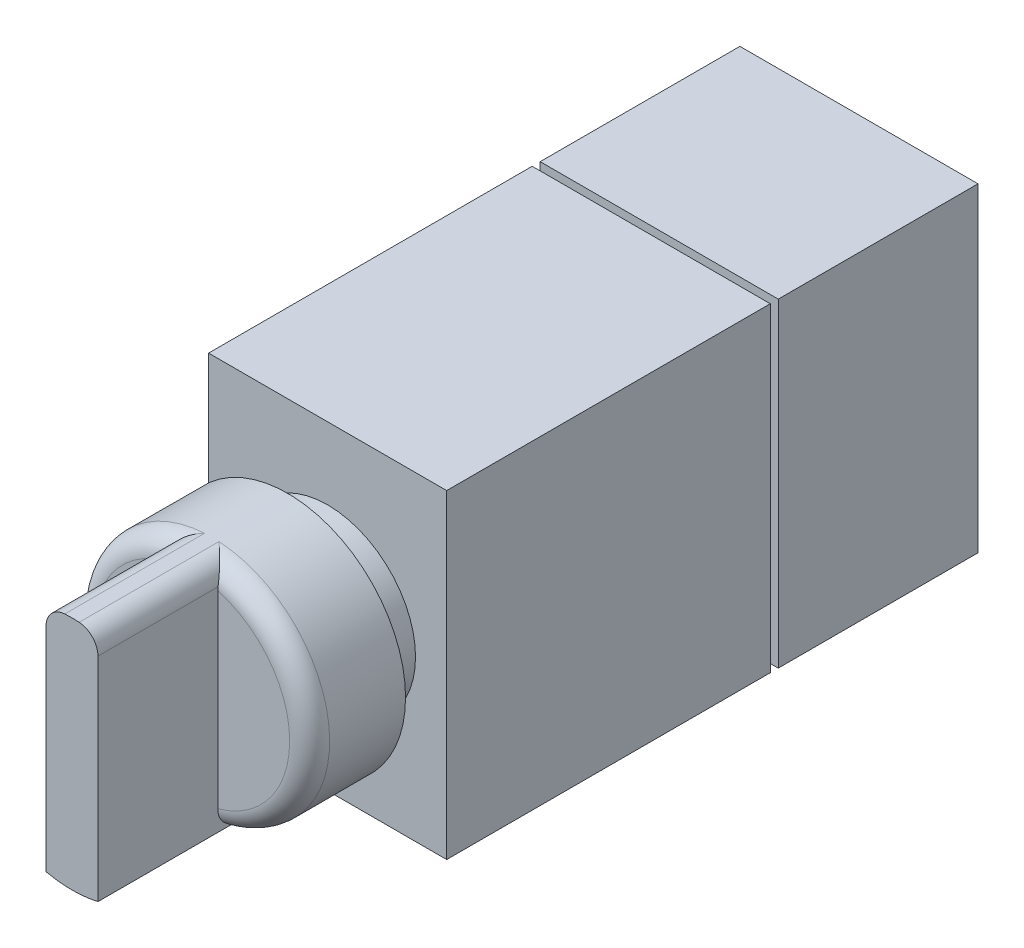
ISO-10303-21;
HEADER;
FILE_DESCRIPTION(('STEP AP214'),'2;1');
FILE_NAME('part.step','',(''),(''),'','','');
FILE_SCHEMA(('AUTOMOTIVE_DESIGN { 1 0 10303 214 1 1 1 1 }'));
ENDSEC;
DATA;
#1=APPLICATION_CONTEXT('core data for automotive mechanical design processes');
#2=APPLICATION_PROTOCOL_DEFINITION('international standard','automotive_design',2000,#1);
#3=PRODUCT_CONTEXT('',#1,'mechanical');
#4=PRODUCT('Part','Part','',(#3));
#5=PRODUCT_RELATED_PRODUCT_CATEGORY('part','',(#4));
#6=PRODUCT_DEFINITION_FORMATION('','',#4);
#7=PRODUCT_DEFINITION_CONTEXT('part definition',#1,'design');
#8=PRODUCT_DEFINITION('design','',#6,#7);
#9=PRODUCT_DEFINITION_SHAPE('','',#8);
#10=(LENGTH_UNIT() NAMED_UNIT(*) SI_UNIT(.MILLI.,.METRE.));
#11=(NAMED_UNIT(*) PLANE_ANGLE_UNIT() SI_UNIT($,.RADIAN.));
#12=(NAMED_UNIT(*) SI_UNIT($,.STERADIAN.) SOLID_ANGLE_UNIT());
#13=UNCERTAINTY_MEASURE_WITH_UNIT(LENGTH_MEASURE(1.E-05),#10,'distance_accuracy_value','');
#14=(GEOMETRIC_REPRESENTATION_CONTEXT(3) GLOBAL_UNCERTAINTY_ASSIGNED_CONTEXT((#13)) GLOBAL_UNIT_ASSIGNED_CONTEXT((#10,
#11,#12)) REPRESENTATION_CONTEXT('',''));
#15=CARTESIAN_POINT('',(0.,0.,0.));
#16=DIRECTION('',(0.,0.,1.));
#17=DIRECTION('',(1.,0.,0.));
#18=AXIS2_PLACEMENT_3D('',#15,#16,#17);
#19=CARTESIAN_POINT('',(-14.9,20.,-71.5));
#20=DIRECTION('',(0.,-1.,0.));
#21=DIRECTION('',(0.,0.,-1.));
#22=AXIS2_PLACEMENT_3D('',#19,#20,#21);
#23=PLANE('',#22);
#24=DIRECTION('',(1.,0.,0.));
#25=VECTOR('',#24,1.);
#26=CARTESIAN_POINT('',(-14.9,20.,-46.5));
#27=LINE('',#26,#25);
#28=CARTESIAN_POINT('',(-14.9,20.,-46.5));
#29=VERTEX_POINT('',#28);
#30=CARTESIAN_POINT('',(14.9,20.,-46.5));
#31=VERTEX_POINT('',#30);
#32=EDGE_CURVE('E108',#29,#31,#27,.T.);
#33=ORIENTED_EDGE('',*,*,#32,.T.);
#34=DIRECTION('',(0.,0.,1.));
#35=VECTOR('',#34,1.);
#36=CARTESIAN_POINT('',(14.9,20.,-71.5));
#37=LINE('',#36,#35);
#38=CARTESIAN_POINT('',(14.9,20.,-71.5));
#39=VERTEX_POINT('',#38);
#40=EDGE_CURVE('E12',#39,#31,#37,.T.);
#41=ORIENTED_EDGE('',*,*,#40,.F.);
#42=DIRECTION('',(1.,0.,0.));
#43=VECTOR('',#42,1.);
#44=CARTESIAN_POINT('',(-14.9,20.,-71.5));
#45=LINE('',#44,#43);
#46=CARTESIAN_POINT('',(-14.9,20.,-71.5));
#47=VERTEX_POINT('',#46);
#48=EDGE_CURVE('E96',#47,#39,#45,.T.);
#49=ORIENTED_EDGE('',*,*,#48,.F.);
#50=DIRECTION('',(0.,0.,1.));
#51=VECTOR('',#50,1.);
#52=CARTESIAN_POINT('',(-14.9,20.,-71.5));
#53=LINE('',#52,#51);
#54=EDGE_CURVE('E104',#47,#29,#53,.T.);
#55=ORIENTED_EDGE('',*,*,#54,.T.);
#56=EDGE_LOOP('',(#33,#41,#49,#55));
#57=FACE_BOUND('',#56,.T.);
#58=ADVANCED_FACE('F45',(#57),#23,.F.);
#59=CARTESIAN_POINT('',(14.9,20.,-71.5));
#60=DIRECTION('',(-1.,0.,0.));
#61=DIRECTION('',(0.,-1.,0.));
#62=AXIS2_PLACEMENT_3D('',#59,#60,#61);
#63=PLANE('',#62);
#64=DIRECTION('',(0.,-1.,0.));
#65=VECTOR('',#64,1.);
#66=CARTESIAN_POINT('',(14.9,20.,-46.5));
#67=LINE('',#66,#65);
#68=CARTESIAN_POINT('',(14.9,-20.,-46.5));
#69=VERTEX_POINT('',#68);
#70=EDGE_CURVE('E100',#31,#69,#67,.T.);
#71=ORIENTED_EDGE('',*,*,#70,.T.);
#72=DIRECTION('',(0.,0.,1.));
#73=VECTOR('',#72,1.);
#74=CARTESIAN_POINT('',(14.9,-20.,-71.5));
#75=LINE('',#74,#73);
#76=CARTESIAN_POINT('',(14.9,-20.,-71.5));
#77=VERTEX_POINT('',#76);
#78=EDGE_CURVE('E53',#77,#69,#75,.T.);
#79=ORIENTED_EDGE('',*,*,#78,.F.);
#80=DIRECTION('',(0.,-1.,0.));
#81=VECTOR('',#80,1.);
#82=CARTESIAN_POINT('',(14.9,20.,-71.5));
#83=LINE('',#82,#81);
#84=EDGE_CURVE('E91',#39,#77,#83,.T.);
#85=ORIENTED_EDGE('',*,*,#84,.F.);
#86=ORIENTED_EDGE('',*,*,#40,.T.);
#87=EDGE_LOOP('',(#71,#79,#85,#86));
#88=FACE_BOUND('',#87,.T.);
#89=ADVANCED_FACE('F99',(#88),#63,.F.);
#90=CARTESIAN_POINT('',(14.9,-20.,-71.5));
#91=DIRECTION('',(0.,1.,0.));
#92=DIRECTION('',(0.,0.,1.));
#93=AXIS2_PLACEMENT_3D('',#90,#91,#92);
#94=PLANE('',#93);
#95=DIRECTION('',(-1.,0.,0.));
#96=VECTOR('',#95,1.);
#97=CARTESIAN_POINT('',(14.9,-20.,-46.5));
#98=LINE('',#97,#96);
#99=CARTESIAN_POINT('',(-14.9,-20.,-46.5));
#100=VERTEX_POINT('',#99);
#101=EDGE_CURVE('E78',#69,#100,#98,.T.);
#102=ORIENTED_EDGE('',*,*,#101,.T.);
#103=DIRECTION('',(0.,0.,1.));
#104=VECTOR('',#103,1.);
#105=CARTESIAN_POINT('',(-14.9,-20.,-71.5));
#106=LINE('',#105,#104);
#107=CARTESIAN_POINT('',(-14.9,-20.,-71.5));
#108=VERTEX_POINT('',#107);
#109=EDGE_CURVE('E101',#108,#100,#106,.T.);
#110=ORIENTED_EDGE('',*,*,#109,.F.);
#111=DIRECTION('',(-1.,0.,0.));
#112=VECTOR('',#111,1.);
#113=CARTESIAN_POINT('',(14.9,-20.,-71.5));
#114=LINE('',#113,#112);
#115=EDGE_CURVE('E94',#77,#108,#114,.T.);
#116=ORIENTED_EDGE('',*,*,#115,.F.);
#117=ORIENTED_EDGE('',*,*,#78,.T.);
#118=EDGE_LOOP('',(#102,#110,#116,#117));
#119=FACE_BOUND('',#118,.T.);
#120=ADVANCED_FACE('F102',(#119),#94,.F.);
#121=CARTESIAN_POINT('',(-14.9,-20.,-71.5));
#122=DIRECTION('',(1.,0.,0.));
#123=DIRECTION('',(0.,1.,0.));
#124=AXIS2_PLACEMENT_3D('',#121,#122,#123);
#125=PLANE('',#124);
#126=DIRECTION('',(0.,1.,0.));
#127=VECTOR('',#126,1.);
#128=CARTESIAN_POINT('',(-14.9,-20.,-46.5));
#129=LINE('',#128,#127);
#130=EDGE_CURVE('E84',#100,#29,#129,.T.);
#131=ORIENTED_EDGE('',*,*,#130,.T.);
#132=ORIENTED_EDGE('',*,*,#54,.F.);
#133=DIRECTION('',(0.,1.,0.));
#134=VECTOR('',#133,1.);
#135=CARTESIAN_POINT('',(-14.9,-20.,-71.5));
#136=LINE('',#135,#134);
#137=EDGE_CURVE('E61',#108,#47,#136,.T.);
#138=ORIENTED_EDGE('',*,*,#137,.F.);
#139=ORIENTED_EDGE('',*,*,#109,.T.);
#140=EDGE_LOOP('',(#131,#132,#138,#139));
#141=FACE_BOUND('',#140,.T.);
#142=ADVANCED_FACE('F115',(#141),#125,.F.);
#143=CARTESIAN_POINT('',(0.,0.,-71.5));
#144=DIRECTION('',(0.,0.,-1.));
#145=DIRECTION('',(-1.,0.,0.));
#146=AXIS2_PLACEMENT_3D('',#143,#144,#145);
#147=PLANE('',#146);
#148=ORIENTED_EDGE('',*,*,#48,.T.);
#149=ORIENTED_EDGE('',*,*,#84,.T.);
#150=ORIENTED_EDGE('',*,*,#115,.T.);
#151=ORIENTED_EDGE('',*,*,#137,.T.);
#152=EDGE_LOOP('',(#148,#149,#150,#151));
#153=FACE_BOUND('',#152,.T.);
#154=ADVANCED_FACE('F92',(#153),#147,.T.);
#155=CARTESIAN_POINT('',(0.,0.,-46.5));
#156=DIRECTION('',(0.,0.,-1.));
#157=DIRECTION('',(-1.,0.,0.));
#158=AXIS2_PLACEMENT_3D('',#155,#156,#157);
#159=PLANE('',#158);
#160=ORIENTED_EDGE('',*,*,#32,.F.);
#161=ORIENTED_EDGE('',*,*,#130,.F.);
#162=ORIENTED_EDGE('',*,*,#101,.F.);
#163=ORIENTED_EDGE('',*,*,#70,.F.);
#164=EDGE_LOOP('',(#160,#161,#162,#163));
#165=FACE_BOUND('',#164,.T.);
#166=ADVANCED_FACE('F118',(#165),#159,.F.);
#167=CLOSED_SHELL('',(#58,#89,#120,#142,#154,#166));
#168=MANIFOLD_SOLID_BREP('B2',#167);
#169=CARTESIAN_POINT('',(0.,0.,-15.));
#170=DIRECTION('',(0.,0.,1.));
#171=DIRECTION('',(1.,0.,0.));
#172=AXIS2_PLACEMENT_3D('',#169,#170,#171);
#173=CYLINDRICAL_SURFACE('',#172,11.);
#174=CARTESIAN_POINT('',(0.,0.,0.));
#175=DIRECTION('',(0.,0.,1.));
#176=DIRECTION('',(1.,0.,0.));
#177=AXIS2_PLACEMENT_3D('',#174,#175,#176);
#178=CIRCLE('',#177,11.);
#179=CARTESIAN_POINT('',(11.,0.,0.));
#180=VERTEX_POINT('',#179);
#181=EDGE_CURVE('E177',#180,#180,#178,.F.);
#182=ORIENTED_EDGE('',*,*,#181,.T.);
#183=EDGE_LOOP('',(#182));
#184=FACE_BOUND('',#183,.T.);
#185=CARTESIAN_POINT('',(0.,0.,-5.));
#186=DIRECTION('',(0.,0.,-1.));
#187=DIRECTION('',(-1.,0.,0.));
#188=AXIS2_PLACEMENT_3D('',#185,#186,#187);
#189=CIRCLE('',#188,11.);
#190=CARTESIAN_POINT('',(-11.,0.,-5.));
#191=VERTEX_POINT('',#190);
#192=EDGE_CURVE('E43',#191,#191,#189,.T.);
#193=ORIENTED_EDGE('',*,*,#192,.F.);
#194=EDGE_LOOP('',(#193));
#195=FACE_BOUND('',#194,.T.);
#196=ADVANCED_FACE('F168',(#184,#195),#173,.T.);
#197=CARTESIAN_POINT('',(0.,0.,0.));
#198=DIRECTION('',(0.,0.,1.));
#199=DIRECTION('',(1.,0.,0.));
#200=AXIS2_PLACEMENT_3D('',#197,#198,#199);
#201=PLANE('',#200);
#202=CARTESIAN_POINT('',(0.,0.,0.));
#203=DIRECTION('',(0.,0.,1.));
#204=DIRECTION('',(1.,0.,0.));
#205=AXIS2_PLACEMENT_3D('',#202,#203,#204);
#206=CIRCLE('',#205,14.75);
#207=CARTESIAN_POINT('',(14.75,0.,0.));
#208=VERTEX_POINT('',#207);
#209=EDGE_CURVE('E428',#208,#208,#206,.T.);
#210=ORIENTED_EDGE('',*,*,#209,.F.);
#211=EDGE_LOOP('',(#210));
#212=FACE_BOUND('',#211,.T.);
#213=ORIENTED_EDGE('',*,*,#181,.F.);
#214=EDGE_LOOP('',(#213));
#215=FACE_BOUND('',#214,.T.);
#216=ADVANCED_FACE('F387',(#212,#215),#201,.F.);
#217=CARTESIAN_POINT('',(0.,0.,12.));
#218=DIRECTION('',(0.,0.,1.));
#219=DIRECTION('',(1.,0.,0.));
#220=AXIS2_PLACEMENT_3D('',#217,#218,#219);
#221=PLANE('',#220);
#222=DIRECTION('',(0.,-1.,0.));
#223=VECTOR('',#222,1.);
#224=CARTESIAN_POINT('',(-3.25,14.3874945699382,12.));
#225=LINE('',#224,#223);
#226=CARTESIAN_POINT('',(-3.25,11.8110118110177,12.));
#227=VERTEX_POINT('',#226);
#228=CARTESIAN_POINT('',(-3.25,-11.8110118110177,12.));
#229=VERTEX_POINT('',#228);
#230=EDGE_CURVE('E296',#227,#229,#225,.T.);
#231=ORIENTED_EDGE('',*,*,#230,.F.);
#232=CARTESIAN_POINT('',(0.,0.,12.));
#233=DIRECTION('',(0.,0.,1.));
#234=DIRECTION('',(1.,0.,0.));
#235=AXIS2_PLACEMENT_3D('',#232,#233,#234);
#236=CIRCLE('',#235,12.25);
#237=EDGE_CURVE('E317',#227,#229,#236,.T.);
#238=ORIENTED_EDGE('',*,*,#237,.T.);
#239=EDGE_LOOP('',(#231,#238));
#240=FACE_BOUND('',#239,.T.);
#241=ADVANCED_FACE('F386',(#240),#221,.T.);
#242=CARTESIAN_POINT('',(0.,0.,12.));
#243=DIRECTION('',(0.,0.,-1.));
#244=DIRECTION('',(-1.,0.,0.));
#245=AXIS2_PLACEMENT_3D('',#242,#243,#244);
#246=CYLINDRICAL_SURFACE('',#245,14.75);
#247=CARTESIAN_POINT('',(0.,0.,9.5));
#248=DIRECTION('',(0.,0.,1.));
#249=DIRECTION('',(1.,0.,0.));
#250=AXIS2_PLACEMENT_3D('',#247,#248,#249);
#251=CIRCLE('',#250,14.75);
#252=CARTESIAN_POINT('',(-3.25,-14.3874945699382,9.5));
#253=VERTEX_POINT('',#252);
#254=CARTESIAN_POINT('',(-0.903061224489796,14.7223293138288,9.5));
#255=VERTEX_POINT('',#254);
#256=EDGE_CURVE('E418',#253,#255,#251,.F.);
#257=ORIENTED_EDGE('',*,*,#256,.T.);
#258=DIRECTION('',(0.,0.,-1.));
#259=VECTOR('',#258,1.);
#260=CARTESIAN_POINT('',(-0.903061224489796,14.7223293138288,12.));
#261=LINE('',#260,#259);
#262=CARTESIAN_POINT('',(-0.903061224489796,14.7223293138288,27.));
#263=VERTEX_POINT('',#262);
#264=EDGE_CURVE('E416',#255,#263,#261,.F.);
#265=ORIENTED_EDGE('',*,*,#264,.T.);
#266=CARTESIAN_POINT('',(0.,0.,27.));
#267=DIRECTION('',(0.,0.,1.));
#268=DIRECTION('',(1.,0.,0.));
#269=AXIS2_PLACEMENT_3D('',#266,#267,#268);
#270=CIRCLE('',#269,14.75);
#271=CARTESIAN_POINT('',(0.903061224489796,14.7223293138288,27.));
#272=VERTEX_POINT('',#271);
#273=EDGE_CURVE('E299',#272,#263,#270,.T.);
#274=ORIENTED_EDGE('',*,*,#273,.F.);
#275=DIRECTION('',(0.,0.,-1.));
#276=VECTOR('',#275,1.);
#277=CARTESIAN_POINT('',(0.903061224489796,14.7223293138288,12.));
#278=LINE('',#277,#276);
#279=CARTESIAN_POINT('',(0.903061224489796,14.7223293138288,9.5));
#280=VERTEX_POINT('',#279);
#281=EDGE_CURVE('E422',#272,#280,#278,.T.);
#282=ORIENTED_EDGE('',*,*,#281,.T.);
#283=CARTESIAN_POINT('',(0.,0.,9.5));
#284=DIRECTION('',(0.,0.,1.));
#285=DIRECTION('',(1.,0.,0.));
#286=AXIS2_PLACEMENT_3D('',#283,#284,#285);
#287=CIRCLE('',#286,14.75);
#288=CARTESIAN_POINT('',(3.25,-14.3874945699382,9.5));
#289=VERTEX_POINT('',#288);
#290=EDGE_CURVE('E424',#280,#289,#287,.F.);
#291=ORIENTED_EDGE('',*,*,#290,.T.);
#292=DIRECTION('',(0.,0.,-1.));
#293=VECTOR('',#292,1.);
#294=CARTESIAN_POINT('',(3.25,-14.3874945699382,27.));
#295=LINE('',#294,#293);
#296=CARTESIAN_POINT('',(3.25,-14.3874945699382,27.));
#297=VERTEX_POINT('',#296);
#298=EDGE_CURVE('E434',#297,#289,#295,.T.);
#299=ORIENTED_EDGE('',*,*,#298,.F.);
#300=CARTESIAN_POINT('',(0.,0.,27.));
#301=DIRECTION('',(0.,0.,1.));
#302=DIRECTION('',(1.,0.,0.));
#303=AXIS2_PLACEMENT_3D('',#300,#301,#302);
#304=CIRCLE('',#303,14.75);
#305=CARTESIAN_POINT('',(-3.25,-14.3874945699382,27.));
#306=VERTEX_POINT('',#305);
#307=EDGE_CURVE('E292',#306,#297,#304,.T.);
#308=ORIENTED_EDGE('',*,*,#307,.F.);
#309=DIRECTION('',(0.,0.,-1.));
#310=VECTOR('',#309,1.);
#311=CARTESIAN_POINT('',(-3.25,-14.3874945699382,27.));
#312=LINE('',#311,#310);
#313=EDGE_CURVE('E304',#306,#253,#312,.T.);
#314=ORIENTED_EDGE('',*,*,#313,.T.);
#315=EDGE_LOOP('',(#257,#265,#274,#282,#291,#299,#308,#314));
#316=FACE_BOUND('',#315,.T.);
#317=ORIENTED_EDGE('',*,*,#209,.T.);
#318=EDGE_LOOP('',(#317));
#319=FACE_BOUND('',#318,.T.);
#320=ADVANCED_FACE('F384',(#316,#319),#246,.T.);
#321=DIRECTION('',(0.,1.,0.));
#322=VECTOR('',#321,1.);
#323=CARTESIAN_POINT('',(3.25,14.3874945699382,12.));
#324=LINE('',#323,#322);
#325=CARTESIAN_POINT('',(3.25,-11.8110118110177,12.));
#326=VERTEX_POINT('',#325);
#327=CARTESIAN_POINT('',(3.25,11.8110118110177,12.));
#328=VERTEX_POINT('',#327);
#329=EDGE_CURVE('E310',#326,#328,#324,.T.);
#330=ORIENTED_EDGE('',*,*,#329,.F.);
#331=CARTESIAN_POINT('',(0.,0.,12.));
#332=DIRECTION('',(0.,0.,1.));
#333=DIRECTION('',(1.,0.,0.));
#334=AXIS2_PLACEMENT_3D('',#331,#332,#333);
#335=CIRCLE('',#334,12.25);
#336=EDGE_CURVE('E319',#326,#328,#335,.T.);
#337=ORIENTED_EDGE('',*,*,#336,.T.);
#338=EDGE_LOOP('',(#330,#337));
#339=FACE_BOUND('',#338,.T.);
#340=ADVANCED_FACE('F380',(#339),#221,.T.);
#341=CARTESIAN_POINT('',(3.25,14.3874945699382,27.));
#342=DIRECTION('',(-1.,0.,0.));
#343=DIRECTION('',(0.,-1.,0.));
#344=AXIS2_PLACEMENT_3D('',#341,#342,#343);
#345=PLANE('',#344);
#346=ORIENTED_EDGE('',*,*,#329,.T.);
#347=CARTESIAN_POINT('',(3.25,11.8110118110177,12.));
#348=CARTESIAN_POINT('',(3.25,11.8807684956395,11.9999999198899));
#349=CARTESIAN_POINT('',(3.25,11.9503140650024,11.9972945365068));
#350=CARTESIAN_POINT('',(3.25,12.0889832163564,11.9864731442201));
#351=CARTESIAN_POINT('',(3.25,12.1581067968667,11.9783571163421));
#352=CARTESIAN_POINT('',(3.25,12.2270192606375,11.967535766217));
#353=B_SPLINE_CURVE_WITH_KNOTS('',3,(#347,#348,#349,#350,#351,#352),.UNSPECIFIED.,.F.,.F.,(4,2,
4),(0.,0.208794511075598,0.41758975436389),.UNSPECIFIED.);
#354=CARTESIAN_POINT('',(3.25,12.2270192606375,11.967535766217));
#355=VERTEX_POINT('',#354);
#356=EDGE_CURVE('E367',#328,#355,#353,.T.);
#357=ORIENTED_EDGE('',*,*,#356,.T.);
#358=DIRECTION('',(0.,0.,-1.));
#359=VECTOR('',#358,1.);
#360=CARTESIAN_POINT('',(3.25,12.2270192606375,27.));
#361=LINE('',#360,#359);
#362=CARTESIAN_POINT('',(3.25,12.2270192606375,27.));
#363=VERTEX_POINT('',#362);
#364=EDGE_CURVE('E184',#355,#363,#361,.F.);
#365=ORIENTED_EDGE('',*,*,#364,.T.);
#366=DIRECTION('',(0.,1.,0.));
#367=VECTOR('',#366,1.);
#368=CARTESIAN_POINT('',(3.25,14.3874945699382,27.));
#369=LINE('',#368,#367);
#370=EDGE_CURVE('E295',#297,#363,#369,.T.);
#371=ORIENTED_EDGE('',*,*,#370,.F.);
#372=ORIENTED_EDGE('',*,*,#298,.T.);
#373=CARTESIAN_POINT('',(3.25,-14.3874945699382,9.5));
#374=CARTESIAN_POINT('',(3.25,-14.3875021906291,9.56899783915327));
#375=CARTESIAN_POINT('',(3.25,-14.3845662513038,9.6379920535132));
#376=CARTESIAN_POINT('',(3.25,-14.372866028365,9.77547851390448));
#377=CARTESIAN_POINT('',(3.25,-14.3641022669076,9.84397080435098));
#378=CARTESIAN_POINT('',(3.25,-14.3408210685253,9.97987834317601));
#379=CARTESIAN_POINT('',(3.25,-14.326311507823,10.0472949350442));
#380=CARTESIAN_POINT('',(3.25,-14.2916693134591,10.1806477996309));
#381=CARTESIAN_POINT('',(3.25,-14.2715367048677,10.246584078948));
#382=CARTESIAN_POINT('',(3.25,-14.2029012376711,10.4415125064845));
#383=CARTESIAN_POINT('',(3.25,-14.1461461985737,10.5677084338868));
#384=CARTESIAN_POINT('',(3.25,-14.0124775503211,10.8088231468166));
#385=CARTESIAN_POINT('',(3.25,-13.9355640530211,10.9237419949135));
#386=CARTESIAN_POINT('',(3.25,-13.7630712287494,11.1403902971383));
#387=CARTESIAN_POINT('',(3.25,-13.6673227569016,11.2419851867952));
#388=CARTESIAN_POINT('',(3.25,-13.4604681361789,11.428109026568));
#389=CARTESIAN_POINT('',(3.25,-13.3493590934518,11.5126347535408));
#390=CARTESIAN_POINT('',(3.25,-13.1121859142978,11.6643871572932));
#391=CARTESIAN_POINT('',(3.25,-12.9858305410134,11.7311581044509));
#392=CARTESIAN_POINT('',(3.25,-12.7239257655717,11.8432097428874));
#393=CARTESIAN_POINT('',(3.25,-12.5883770060166,11.8884919344282));
#394=CARTESIAN_POINT('',(3.25,-12.3455987277898,11.9483572441155));
#395=CARTESIAN_POINT('',(3.25,-12.2395204871483,11.9677329972917));
#396=CARTESIAN_POINT('',(3.25,-12.0259722899255,11.9935542697227));
#397=CARTESIAN_POINT('',(3.25,-11.9185048262937,12.0000203879266));
#398=CARTESIAN_POINT('',(3.25,-11.8110118110177,12.));
#399=B_SPLINE_CURVE_WITH_KNOTS('',3,(#373,#374,#375,#376,#377,#378,#379,#380,#381,#382,#383,
#384,#385,#386,#387,#388,#389,#390,#391,#392,#393,#394,#395,#396,#397,#398),.UNSPECIFIED.,.F.,
.F.,(4,2,2,2,2,2,2,2,2,2,2,2,4),(0.,0.206924663063927,0.41383078877204,0.620454268214768,
0.827076826448499,1.24006886610139,1.65305861419635,2.06994203103271,2.48690409385265,
2.91371418923844,3.34049448200584,3.66324040456414,3.98547093243843),.UNSPECIFIED.);
#400=EDGE_CURVE('E357',#289,#326,#399,.T.);
#401=ORIENTED_EDGE('',*,*,#400,.T.);
#402=EDGE_LOOP('',(#346,#357,#365,#371,#372,#401));
#403=FACE_BOUND('',#402,.T.);
#404=ADVANCED_FACE('F376',(#403),#345,.F.);
#405=CARTESIAN_POINT('',(-3.25,14.3874945699382,27.));
#406=DIRECTION('',(1.,0.,0.));
#407=DIRECTION('',(0.,0.,-1.));
#408=AXIS2_PLACEMENT_3D('',#405,#406,#407);
#409=PLANE('',#408);
#410=DIRECTION('',(0.,-1.,0.));
#411=VECTOR('',#410,1.);
#412=CARTESIAN_POINT('',(-3.25,14.3874945699382,27.));
#413=LINE('',#412,#411);
#414=CARTESIAN_POINT('',(-3.25,12.2270192606375,27.));
#415=VERTEX_POINT('',#414);
#416=EDGE_CURVE('E302',#415,#306,#413,.T.);
#417=ORIENTED_EDGE('',*,*,#416,.F.);
#418=DIRECTION('',(0.,0.,-1.));
#419=VECTOR('',#418,1.);
#420=CARTESIAN_POINT('',(-3.25,12.2270192606375,27.));
#421=LINE('',#420,#419);
#422=CARTESIAN_POINT('',(-3.25,12.2270192606375,11.967535766217));
#423=VERTEX_POINT('',#422);
#424=EDGE_CURVE('E192',#415,#423,#421,.T.);
#425=ORIENTED_EDGE('',*,*,#424,.T.);
#426=CARTESIAN_POINT('',(-3.25,12.2270192606375,11.967535766217));
#427=CARTESIAN_POINT('',(-3.25,12.1581067968667,11.9783571163421));
#428=CARTESIAN_POINT('',(-3.25,12.0889832163563,11.98647314422));
#429=CARTESIAN_POINT('',(-3.25,11.9503140650024,11.9972945365068));
#430=CARTESIAN_POINT('',(-3.25,11.8807684956395,11.99999991989));
#431=CARTESIAN_POINT('',(-3.25,11.8110118110177,12.0000000000001));
#432=B_SPLINE_CURVE_WITH_KNOTS('',3,(#426,#427,#428,#429,#430,#431),.UNSPECIFIED.,.F.,.F.,(4,2,
4),(0.,0.208795243288301,0.417589754363903),.UNSPECIFIED.);
#433=EDGE_CURVE('E329',#423,#227,#432,.T.);
#434=ORIENTED_EDGE('',*,*,#433,.T.);
#435=ORIENTED_EDGE('',*,*,#230,.T.);
#436=CARTESIAN_POINT('',(-3.25,-11.8110118110177,12.));
#437=CARTESIAN_POINT('',(-3.25,-11.8853412177929,11.9999983176152));
#438=CARTESIAN_POINT('',(-3.25,-11.959637364638,11.9969164558023));
#439=CARTESIAN_POINT('',(-3.25,-12.1077218167793,11.9845888599736));
#440=CARTESIAN_POINT('',(-3.25,-12.1815100818366,11.9753426431151));
#441=CARTESIAN_POINT('',(-3.25,-12.4013669747656,11.9383640944624));
#442=CARTESIAN_POINT('',(-3.25,-12.5459959217625,11.9013918664646));
#443=CARTESIAN_POINT('',(-3.25,-12.8270239249038,11.8034876194813));
#444=CARTESIAN_POINT('',(-3.25,-12.9634137315918,11.7425292291953));
#445=CARTESIAN_POINT('',(-3.25,-13.2236563062562,11.5981065469625));
#446=CARTESIAN_POINT('',(-3.25,-13.3475164058106,11.5146555222498));
#447=CARTESIAN_POINT('',(-3.25,-13.5762990046305,11.3294464101696));
#448=CARTESIAN_POINT('',(-3.25,-13.6815716973265,11.2281209654662));
#449=CARTESIAN_POINT('',(-3.25,-13.8730234160162,11.008732830662));
#450=CARTESIAN_POINT('',(-3.25,-13.9591994127795,10.8906674900442));
#451=CARTESIAN_POINT('',(-3.25,-14.1073793155098,10.6448583858394));
#452=CARTESIAN_POINT('',(-3.25,-14.1700047819292,10.5174886190948));
#453=CARTESIAN_POINT('',(-3.25,-14.2724073082748,10.2539334539934));
#454=CARTESIAN_POINT('',(-3.25,-14.3122066486239,10.1177567969901));
#455=CARTESIAN_POINT('',(-3.25,-14.3557606367392,9.90036692461203));
#456=CARTESIAN_POINT('',(-3.25,-14.3676556399659,9.82069971402764));
#457=CARTESIAN_POINT('',(-3.25,-14.3835191165095,9.66070119366637));
#458=CARTESIAN_POINT('',(-3.25,-14.3874994819494,9.58037106262015));
#459=CARTESIAN_POINT('',(-3.25,-14.3874945699382,9.5));
#460=B_SPLINE_CURVE_WITH_KNOTS('',3,(#436,#437,#438,#439,#440,#441,#442,#443,#444,#445,#446,
#447,#448,#449,#450,#451,#452,#453,#454,#455,#456,#457,#458,#459),.UNSPECIFIED.,.F.,.F.,(4,2,2,
2,2,2,2,2,2,2,2,4),(0.,0.222856809428138,0.445731076875971,0.891277499071287,1.33731514684655,
1.78309027382354,2.21927175746139,2.65552238132761,3.07927974893035,3.50262278286266,
3.74391999664318,3.98485437498497),.UNSPECIFIED.);
#461=EDGE_CURVE('E321',#229,#253,#460,.T.);
#462=ORIENTED_EDGE('',*,*,#461,.T.);
#463=ORIENTED_EDGE('',*,*,#313,.F.);
#464=EDGE_LOOP('',(#417,#425,#434,#435,#462,#463));
#465=FACE_BOUND('',#464,.T.);
#466=ADVANCED_FACE('F334',(#465),#409,.F.);
#467=CARTESIAN_POINT('',(0.,0.,27.));
#468=DIRECTION('',(0.,0.,1.));
#469=DIRECTION('',(1.,0.,0.));
#470=AXIS2_PLACEMENT_3D('',#467,#468,#469);
#471=PLANE('',#470);
#472=ORIENTED_EDGE('',*,*,#273,.T.);
#473=CARTESIAN_POINT('',(-0.75,12.2270192606375,27.));
#474=DIRECTION('',(0.,0.,1.));
#475=DIRECTION('',(1.,0.,0.));
#476=AXIS2_PLACEMENT_3D('',#473,#474,#475);
#477=CIRCLE('',#476,2.5);
#478=EDGE_CURVE('E314',#263,#415,#477,.T.);
#479=ORIENTED_EDGE('',*,*,#478,.T.);
#480=ORIENTED_EDGE('',*,*,#416,.T.);
#481=ORIENTED_EDGE('',*,*,#307,.T.);
#482=ORIENTED_EDGE('',*,*,#370,.T.);
#483=CARTESIAN_POINT('',(0.75,12.2270192606375,27.));
#484=DIRECTION('',(0.,0.,1.));
#485=DIRECTION('',(1.,0.,0.));
#486=AXIS2_PLACEMENT_3D('',#483,#484,#485);
#487=CIRCLE('',#486,2.5);
#488=EDGE_CURVE('E411',#363,#272,#487,.T.);
#489=ORIENTED_EDGE('',*,*,#488,.T.);
#490=EDGE_LOOP('',(#472,#479,#480,#481,#482,#489));
#491=FACE_BOUND('',#490,.T.);
#492=ADVANCED_FACE('F343',(#491),#471,.T.);
#493=CARTESIAN_POINT('',(0.,0.,9.5));
#494=DIRECTION('',(0.,0.,1.));
#495=DIRECTION('',(1.,0.,0.));
#496=AXIS2_PLACEMENT_3D('',#493,#494,#495);
#497=TOROIDAL_SURFACE('',#496,12.25,2.5);
#498=ORIENTED_EDGE('',*,*,#237,.F.);
#499=ORIENTED_EDGE('',*,*,#433,.F.);
#500=CARTESIAN_POINT('',(-3.25,12.2270192606375,11.967535766217));
#501=CARTESIAN_POINT('',(-3.25001256630195,12.2904661370351,11.9575650099832));
#502=CARTESIAN_POINT('',(-3.24758546095704,12.3535274391969,11.9453882959632));
#503=CARTESIAN_POINT('',(-3.2381214868486,12.4783024107862,11.9170329871884));
#504=CARTESIAN_POINT('',(-3.23109120613879,12.5400178761312,11.9008601322665));
#505=CARTESIAN_POINT('',(-3.21277328416499,12.6611512455245,11.8650566282571));
#506=CARTESIAN_POINT('',(-3.2015252368974,12.7205850187419,11.8454590152865));
#507=CARTESIAN_POINT('',(-3.17507988650127,12.837411143351,11.8030937532275));
#508=CARTESIAN_POINT('',(-3.15988119641916,12.8948027697447,11.7803249921488));
#509=CARTESIAN_POINT('',(-3.10903529641063,13.0628261491759,11.708103837651));
#510=CARTESIAN_POINT('',(-3.06801043138458,13.1701034191795,11.6544932964783));
#511=CARTESIAN_POINT('',(-2.97398587515571,13.374454138862,11.5386579859179));
#512=CARTESIAN_POINT('',(-2.92095306382053,13.4714982575017,11.4764095791122));
#513=CARTESIAN_POINT('',(-2.77673374643691,13.6995651812087,11.3132848080461));
#514=CARTESIAN_POINT('',(-2.67957433703231,13.823984977999,11.2084091318565));
#515=CARTESIAN_POINT('',(-2.46933465159971,14.0484542580205,10.9889992784046));
#516=CARTESIAN_POINT('',(-2.35622506832672,14.1484579332411,10.8744474809511));
#517=CARTESIAN_POINT('',(-2.08829864890103,14.3467664461365,10.6090707370597));
#518=CARTESIAN_POINT('',(-1.93018665427344,14.43818425757,10.4564243731455));
#519=CARTESIAN_POINT('',(-1.602986767989,14.5838084936902,10.1459999298268));
#520=CARTESIAN_POINT('',(-1.43391264391353,14.6380606412644,9.98822840694952));
#521=CARTESIAN_POINT('',(-1.1460813833823,14.6982818007393,9.72240200250231));
#522=CARTESIAN_POINT('',(-1.02885040650046,14.7142169665665,9.61487220993806));
#523=CARTESIAN_POINT('',(-0.908457714789669,14.721993901604,9.50492743081025));
#524=CARTESIAN_POINT('',(-0.905759586614982,14.7221637969187,9.5024636996565));
#525=CARTESIAN_POINT('',(-0.903061224489795,14.7223293138288,9.5));
#526=B_SPLINE_CURVE_WITH_KNOTS('',3,(#500,#501,#502,#503,#504,#505,#506,#507,#508,#509,#510,
#511,#512,#513,#514,#515,#516,#517,#518,#519,#520,#521,#522,#523,#524,#525),.UNSPECIFIED.,.F.,
.F.,(4,2,2,2,2,2,2,2,2,2,2,2,4),(0.,0.192535159096366,0.384795362878453,0.575294169781853,
0.765859945708521,1.14449302042082,1.52418343909776,2.08962531846578,2.65612003052671,
3.3665441496014,4.07609269549744,4.5547913802459,4.56576445348628),.UNSPECIFIED.);
#527=EDGE_CURVE('E286',#255,#423,#526,.F.);
#528=ORIENTED_EDGE('',*,*,#527,.F.);
#529=ORIENTED_EDGE('',*,*,#256,.F.);
#530=ORIENTED_EDGE('',*,*,#461,.F.);
#531=EDGE_LOOP('',(#498,#499,#528,#529,#530));
#532=FACE_BOUND('',#531,.T.);
#533=ADVANCED_FACE('F338',(#532),#497,.T.);
#534=CARTESIAN_POINT('',(-0.75,12.2270192606375,12.));
#535=DIRECTION('',(0.,0.,-1.));
#536=DIRECTION('',(-1.,0.,0.));
#537=AXIS2_PLACEMENT_3D('',#534,#535,#536);
#538=CYLINDRICAL_SURFACE('',#537,2.5);
#539=ORIENTED_EDGE('',*,*,#478,.F.);
#540=ORIENTED_EDGE('',*,*,#264,.F.);
#541=ORIENTED_EDGE('',*,*,#527,.T.);
#542=ORIENTED_EDGE('',*,*,#424,.F.);
#543=EDGE_LOOP('',(#539,#540,#541,#542));
#544=FACE_BOUND('',#543,.T.);
#545=ADVANCED_FACE('F342',(#544),#538,.T.);
#546=CARTESIAN_POINT('',(0.,0.,9.5));
#547=DIRECTION('',(0.,0.,1.));
#548=DIRECTION('',(1.,0.,0.));
#549=AXIS2_PLACEMENT_3D('',#546,#547,#548);
#550=TOROIDAL_SURFACE('',#549,12.25,2.5);
#551=ORIENTED_EDGE('',*,*,#400,.F.);
#552=ORIENTED_EDGE('',*,*,#290,.F.);
#553=CARTESIAN_POINT('',(3.25,12.2270192606375,11.967535766217));
#554=CARTESIAN_POINT('',(3.25001256630195,12.2904661370351,11.9575650099832));
#555=CARTESIAN_POINT('',(3.24758546095704,12.3535274391969,11.9453882959632));
#556=CARTESIAN_POINT('',(3.2381214868486,12.4783024107862,11.9170329871884));
#557=CARTESIAN_POINT('',(3.23109120613879,12.5400178761312,11.9008601322665));
#558=CARTESIAN_POINT('',(3.21277328416499,12.6611512455245,11.8650566282571));
#559=CARTESIAN_POINT('',(3.2015252368974,12.720585018742,11.8454590152865));
#560=CARTESIAN_POINT('',(3.17507988650127,12.837411143351,11.8030937532275));
#561=CARTESIAN_POINT('',(3.15988119641916,12.8948027697447,11.7803249921488));
#562=CARTESIAN_POINT('',(3.10903529641063,13.0628261491759,11.708103837651));
#563=CARTESIAN_POINT('',(3.06801043138458,13.1701034191795,11.6544932964783));
#564=CARTESIAN_POINT('',(2.97398587515571,13.374454138862,11.5386579859179));
#565=CARTESIAN_POINT('',(2.92095306382053,13.4714982575017,11.4764095791122));
#566=CARTESIAN_POINT('',(2.77673374643691,13.6995651812087,11.3132848080461));
#567=CARTESIAN_POINT('',(2.67957433703232,13.823984977999,11.2084091318565));
#568=CARTESIAN_POINT('',(2.4693346515997,14.0484542580205,10.9889992784046));
#569=CARTESIAN_POINT('',(2.35622506832668,14.1484579332411,10.8744474809512));
#570=CARTESIAN_POINT('',(2.08829864890108,14.3467664461365,10.6090707370596));
#571=CARTESIAN_POINT('',(1.93018665427363,14.43818425757,10.4564243731453));
#572=CARTESIAN_POINT('',(1.60298676798883,14.5838084936903,10.145999929827));
#573=CARTESIAN_POINT('',(1.43391264391285,14.6380606412644,9.98822840695025));
#574=CARTESIAN_POINT('',(1.14608138338276,14.6982818007392,9.72240200250179));
#575=CARTESIAN_POINT('',(1.02885040650191,14.7142169665664,9.61487220993646));
#576=CARTESIAN_POINT('',(0.908457714789735,14.721993901604,9.50492743081017));
#577=CARTESIAN_POINT('',(0.905759586615016,14.7221637969187,9.50246369965646));
#578=CARTESIAN_POINT('',(0.903061224489796,14.7223293138288,9.5));
#579=B_SPLINE_CURVE_WITH_KNOTS('',3,(#553,#554,#555,#556,#557,#558,#559,#560,#561,#562,#563,
#564,#565,#566,#567,#568,#569,#570,#571,#572,#573,#574,#575,#576,#577,#578),.UNSPECIFIED.,.F.,
.F.,(4,2,2,2,2,2,2,2,2,2,2,2,4),(0.,0.192535159096368,0.384795362878455,0.575294169781855,
0.765859945708522,1.14449302042082,1.52418343909776,2.08962531846579,2.65612003052672,
3.36654414960139,4.07609269549745,4.5547913802459,4.56576445348628),.UNSPECIFIED.);
#580=EDGE_CURVE('E284',#355,#280,#579,.T.);
#581=ORIENTED_EDGE('',*,*,#580,.F.);
#582=ORIENTED_EDGE('',*,*,#356,.F.);
#583=ORIENTED_EDGE('',*,*,#336,.F.);
#584=EDGE_LOOP('',(#551,#552,#581,#582,#583));
#585=FACE_BOUND('',#584,.T.);
#586=ADVANCED_FACE('F347',(#585),#550,.T.);
#587=CARTESIAN_POINT('',(0.75,12.2270192606375,12.));
#588=DIRECTION('',(0.,0.,-1.));
#589=DIRECTION('',(-1.,0.,0.));
#590=AXIS2_PLACEMENT_3D('',#587,#588,#589);
#591=CYLINDRICAL_SURFACE('',#590,2.5);
#592=ORIENTED_EDGE('',*,*,#488,.F.);
#593=ORIENTED_EDGE('',*,*,#364,.F.);
#594=ORIENTED_EDGE('',*,*,#580,.T.);
#595=ORIENTED_EDGE('',*,*,#281,.F.);
#596=EDGE_LOOP('',(#592,#593,#594,#595));
#597=FACE_BOUND('',#596,.T.);
#598=ADVANCED_FACE('F170',(#597),#591,.T.);
#599=CARTESIAN_POINT('',(0.,0.,-5.));
#600=DIRECTION('',(0.,0.,-1.));
#601=DIRECTION('',(-1.,0.,0.));
#602=AXIS2_PLACEMENT_3D('',#599,#600,#601);
#603=PLANE('',#602);
#604=DIRECTION('',(0.,1.,0.));
#605=VECTOR('',#604,1.);
#606=CARTESIAN_POINT('',(-14.9,20.,-5.));
#607=LINE('',#606,#605);
#608=CARTESIAN_POINT('',(-14.9,-20.,-5.));
#609=VERTEX_POINT('',#608);
#610=CARTESIAN_POINT('',(-14.9,20.,-5.));
#611=VERTEX_POINT('',#610);
#612=EDGE_CURVE('E283',#609,#611,#607,.T.);
#613=ORIENTED_EDGE('',*,*,#612,.F.);
#614=DIRECTION('',(-1.,0.,0.));
#615=VECTOR('',#614,1.);
#616=CARTESIAN_POINT('',(14.9,-20.,-5.));
#617=LINE('',#616,#615);
#618=CARTESIAN_POINT('',(14.9,-20.,-5.));
#619=VERTEX_POINT('',#618);
#620=EDGE_CURVE('E279',#619,#609,#617,.T.);
#621=ORIENTED_EDGE('',*,*,#620,.F.);
#622=DIRECTION('',(0.,-1.,0.));
#623=VECTOR('',#622,1.);
#624=CARTESIAN_POINT('',(14.9,20.,-5.));
#625=LINE('',#624,#623);
#626=CARTESIAN_POINT('',(14.9,20.,-5.));
#627=VERTEX_POINT('',#626);
#628=EDGE_CURVE('E565',#627,#619,#625,.T.);
#629=ORIENTED_EDGE('',*,*,#628,.F.);
#630=DIRECTION('',(1.,0.,0.));
#631=VECTOR('',#630,1.);
#632=CARTESIAN_POINT('',(14.9,20.,-5.));
#633=LINE('',#632,#631);
#634=EDGE_CURVE('E569',#611,#627,#633,.T.);
#635=ORIENTED_EDGE('',*,*,#634,.F.);
#636=EDGE_LOOP('',(#613,#621,#629,#635));
#637=FACE_BOUND('',#636,.T.);
#638=ORIENTED_EDGE('',*,*,#192,.T.);
#639=EDGE_LOOP('',(#638));
#640=FACE_BOUND('',#639,.T.);
#641=ADVANCED_FACE('F446',(#637,#640),#603,.F.);
#642=CARTESIAN_POINT('',(-14.9,20.,-45.5));
#643=DIRECTION('',(1.,0.,0.));
#644=DIRECTION('',(0.,1.,0.));
#645=AXIS2_PLACEMENT_3D('',#642,#643,#644);
#646=PLANE('',#645);
#647=ORIENTED_EDGE('',*,*,#612,.T.);
#648=DIRECTION('',(0.,0.,1.));
#649=VECTOR('',#648,1.);
#650=CARTESIAN_POINT('',(-14.9,20.,-45.5));
#651=LINE('',#650,#649);
#652=CARTESIAN_POINT('',(-14.9,20.,-45.5));
#653=VERTEX_POINT('',#652);
#654=EDGE_CURVE('E263',#653,#611,#651,.T.);
#655=ORIENTED_EDGE('',*,*,#654,.F.);
#656=DIRECTION('',(0.,1.,0.));
#657=VECTOR('',#656,1.);
#658=CARTESIAN_POINT('',(-14.9,20.,-45.5));
#659=LINE('',#658,#657);
#660=CARTESIAN_POINT('',(-14.9,-20.,-45.5));
#661=VERTEX_POINT('',#660);
#662=EDGE_CURVE('E270',#661,#653,#659,.T.);
#663=ORIENTED_EDGE('',*,*,#662,.F.);
#664=DIRECTION('',(0.,0.,1.));
#665=VECTOR('',#664,1.);
#666=CARTESIAN_POINT('',(-14.9,-20.,-45.5));
#667=LINE('',#666,#665);
#668=EDGE_CURVE('E562',#661,#609,#667,.T.);
#669=ORIENTED_EDGE('',*,*,#668,.T.);
#670=EDGE_LOOP('',(#647,#655,#663,#669));
#671=FACE_BOUND('',#670,.T.);
#672=ADVANCED_FACE('F281',(#671),#646,.F.);
#673=CARTESIAN_POINT('',(14.9,20.,-45.5));
#674=DIRECTION('',(0.,-1.,0.));
#675=DIRECTION('',(0.,0.,-1.));
#676=AXIS2_PLACEMENT_3D('',#673,#674,#675);
#677=PLANE('',#676);
#678=ORIENTED_EDGE('',*,*,#634,.T.);
#679=DIRECTION('',(0.,0.,1.));
#680=VECTOR('',#679,1.);
#681=CARTESIAN_POINT('',(14.9,20.,-45.5));
#682=LINE('',#681,#680);
#683=CARTESIAN_POINT('',(14.9,20.,-45.5));
#684=VERTEX_POINT('',#683);
#685=EDGE_CURVE('E266',#684,#627,#682,.T.);
#686=ORIENTED_EDGE('',*,*,#685,.F.);
#687=DIRECTION('',(1.,0.,0.));
#688=VECTOR('',#687,1.);
#689=CARTESIAN_POINT('',(14.9,20.,-45.5));
#690=LINE('',#689,#688);
#691=EDGE_CURVE('E259',#653,#684,#690,.T.);
#692=ORIENTED_EDGE('',*,*,#691,.F.);
#693=ORIENTED_EDGE('',*,*,#654,.T.);
#694=EDGE_LOOP('',(#678,#686,#692,#693));
#695=FACE_BOUND('',#694,.T.);
#696=ADVANCED_FACE('F261',(#695),#677,.F.);
#697=CARTESIAN_POINT('',(14.9,20.,-45.5));
#698=DIRECTION('',(-1.,0.,0.));
#699=DIRECTION('',(0.,-1.,0.));
#700=AXIS2_PLACEMENT_3D('',#697,#698,#699);
#701=PLANE('',#700);
#702=ORIENTED_EDGE('',*,*,#628,.T.);
#703=DIRECTION('',(0.,0.,1.));
#704=VECTOR('',#703,1.);
#705=CARTESIAN_POINT('',(14.9,-20.,-45.5));
#706=LINE('',#705,#704);
#707=CARTESIAN_POINT('',(14.9,-20.,-45.5));
#708=VERTEX_POINT('',#707);
#709=EDGE_CURVE('E288',#708,#619,#706,.T.);
#710=ORIENTED_EDGE('',*,*,#709,.F.);
#711=DIRECTION('',(0.,-1.,0.));
#712=VECTOR('',#711,1.);
#713=CARTESIAN_POINT('',(14.9,20.,-45.5));
#714=LINE('',#713,#712);
#715=EDGE_CURVE('E269',#684,#708,#714,.T.);
#716=ORIENTED_EDGE('',*,*,#715,.F.);
#717=ORIENTED_EDGE('',*,*,#685,.T.);
#718=EDGE_LOOP('',(#702,#710,#716,#717));
#719=FACE_BOUND('',#718,.T.);
#720=ADVANCED_FACE('F530',(#719),#701,.F.);
#721=CARTESIAN_POINT('',(14.9,-20.,-45.5));
#722=DIRECTION('',(0.,1.,0.));
#723=DIRECTION('',(0.,0.,1.));
#724=AXIS2_PLACEMENT_3D('',#721,#722,#723);
#725=PLANE('',#724);
#726=ORIENTED_EDGE('',*,*,#620,.T.);
#727=ORIENTED_EDGE('',*,*,#668,.F.);
#728=DIRECTION('',(-1.,0.,0.));
#729=VECTOR('',#728,1.);
#730=CARTESIAN_POINT('',(14.9,-20.,-45.5));
#731=LINE('',#730,#729);
#732=EDGE_CURVE('E275',#708,#661,#731,.T.);
#733=ORIENTED_EDGE('',*,*,#732,.F.);
#734=ORIENTED_EDGE('',*,*,#709,.T.);
#735=EDGE_LOOP('',(#726,#727,#733,#734));
#736=FACE_BOUND('',#735,.T.);
#737=ADVANCED_FACE('F538',(#736),#725,.F.);
#738=CARTESIAN_POINT('',(0.,0.,-45.5));
#739=DIRECTION('',(0.,0.,-1.));
#740=DIRECTION('',(-1.,0.,0.));
#741=AXIS2_PLACEMENT_3D('',#738,#739,#740);
#742=PLANE('',#741);
#743=ORIENTED_EDGE('',*,*,#662,.T.);
#744=ORIENTED_EDGE('',*,*,#691,.T.);
#745=ORIENTED_EDGE('',*,*,#715,.T.);
#746=ORIENTED_EDGE('',*,*,#732,.T.);
#747=EDGE_LOOP('',(#743,#744,#745,#746));
#748=FACE_BOUND('',#747,.T.);
#749=ADVANCED_FACE('F273',(#748),#742,.T.);
#750=CLOSED_SHELL('',(#196,#216,#241,#320,#340,#404,#466,#492,#533,#545,#586,#598,#641,#672,
#696,#720,#737,#749));
#751=MANIFOLD_SOLID_BREP('B6',#750);
#752=ADVANCED_BREP_SHAPE_REPRESENTATION('',(#18,#168,#751),#14);
#753=SHAPE_DEFINITION_REPRESENTATION(#9,#752);
ENDSEC;
END-ISO-10303-21;
